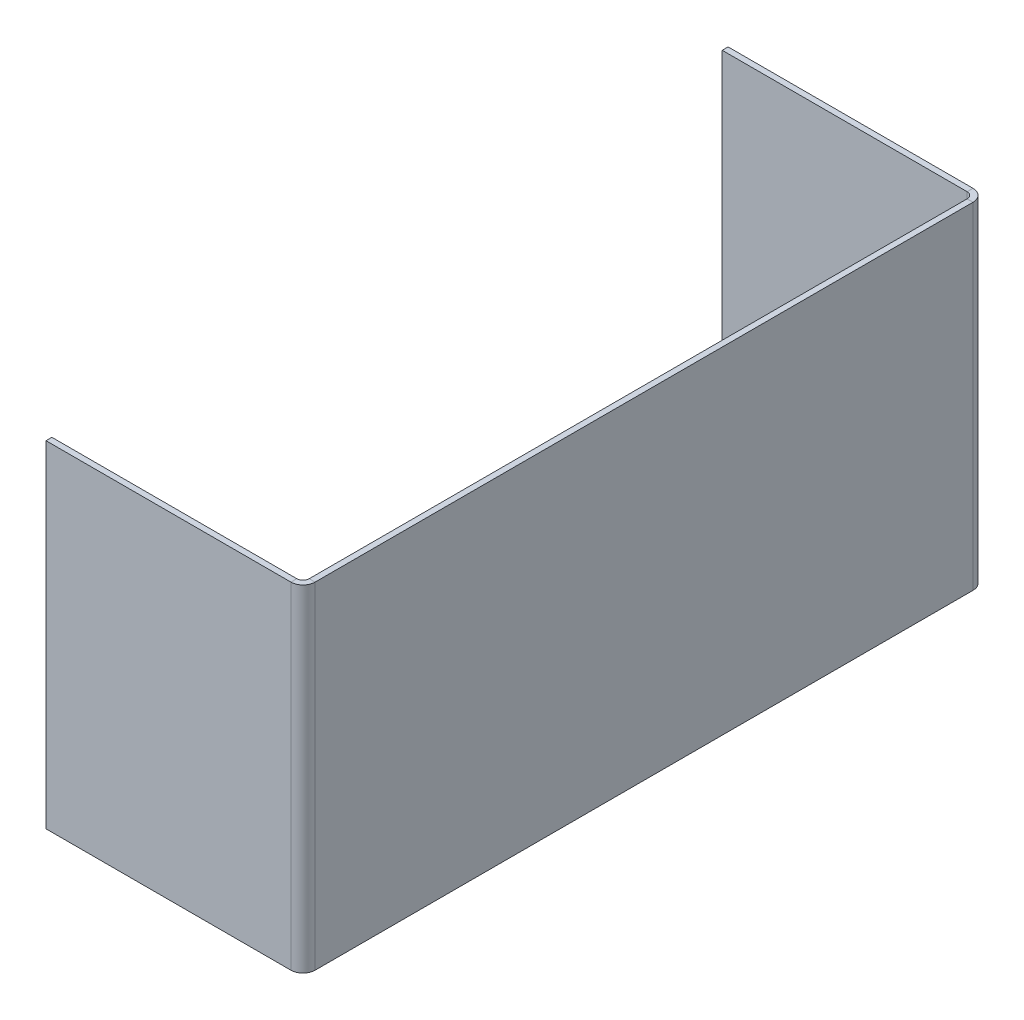
ISO-10303-21;
HEADER;
FILE_DESCRIPTION(('STEP AP214'),'2;1');
FILE_NAME('part.step','',(''),(''),'','','');
FILE_SCHEMA(('AUTOMOTIVE_DESIGN { 1 0 10303 214 1 1 1 1 }'));
ENDSEC;
DATA;
#1=APPLICATION_CONTEXT('core data for automotive mechanical design processes');
#2=APPLICATION_PROTOCOL_DEFINITION('international standard','automotive_design',2000,#1);
#3=PRODUCT_CONTEXT('',#1,'mechanical');
#4=PRODUCT('Part','Part','',(#3));
#5=PRODUCT_RELATED_PRODUCT_CATEGORY('part','',(#4));
#6=PRODUCT_DEFINITION_FORMATION('','',#4);
#7=PRODUCT_DEFINITION_CONTEXT('part definition',#1,'design');
#8=PRODUCT_DEFINITION('design','',#6,#7);
#9=PRODUCT_DEFINITION_SHAPE('','',#8);
#10=(LENGTH_UNIT() NAMED_UNIT(*) SI_UNIT(.MILLI.,.METRE.));
#11=(NAMED_UNIT(*) PLANE_ANGLE_UNIT() SI_UNIT($,.RADIAN.));
#12=(NAMED_UNIT(*) SI_UNIT($,.STERADIAN.) SOLID_ANGLE_UNIT());
#13=UNCERTAINTY_MEASURE_WITH_UNIT(LENGTH_MEASURE(1.E-05),#10,'distance_accuracy_value','');
#14=(GEOMETRIC_REPRESENTATION_CONTEXT(3) GLOBAL_UNCERTAINTY_ASSIGNED_CONTEXT((#13)) GLOBAL_UNIT_ASSIGNED_CONTEXT((#10,
#11,#12)) REPRESENTATION_CONTEXT('',''));
#15=CARTESIAN_POINT('',(0.,0.,0.));
#16=DIRECTION('',(0.,0.,1.));
#17=DIRECTION('',(1.,0.,0.));
#18=AXIS2_PLACEMENT_3D('',#15,#16,#17);
#19=CARTESIAN_POINT('',(29.3561924906218,40.,-30.1168136443477));
#20=DIRECTION('',(0.,1.,0.));
#21=DIRECTION('',(-1.,0.,0.));
#22=AXIS2_PLACEMENT_3D('',#19,#20,#21);
#23=PLANE('',#22);
#24=DIRECTION('',(0.,0.,-1.));
#25=VECTOR('',#24,1.);
#26=CARTESIAN_POINT('',(28.6561924906218,40.,-30.1168136443477));
#27=LINE('',#26,#25);
#28=CARTESIAN_POINT('',(28.6561924906214,40.,79.0297727113047));
#29=VERTEX_POINT('',#28);
#30=CARTESIAN_POINT('',(28.6561924906217,40.,0.736600000000004));
#31=VERTEX_POINT('',#30);
#32=EDGE_CURVE('E72',#29,#31,#27,.T.);
#33=ORIENTED_EDGE('',*,*,#32,.F.);
#34=DIRECTION('',(1.,0.,0.));
#35=VECTOR('',#34,1.);
#36=CARTESIAN_POINT('',(29.3561924906214,40.,79.0297727113047));
#37=LINE('',#36,#35);
#38=CARTESIAN_POINT('',(29.3561924906214,40.,79.0297727113047));
#39=VERTEX_POINT('',#38);
#40=EDGE_CURVE('E243',#29,#39,#37,.T.);
#41=ORIENTED_EDGE('',*,*,#40,.T.);
#42=DIRECTION('',(0.,0.,-1.));
#43=VECTOR('',#42,1.);
#44=CARTESIAN_POINT('',(29.3561924906218,40.,-30.1168136443477));
#45=LINE('',#44,#43);
#46=CARTESIAN_POINT('',(29.3561924906217,40.,0.73660000000001));
#47=VERTEX_POINT('',#46);
#48=EDGE_CURVE('E51',#39,#47,#45,.T.);
#49=ORIENTED_EDGE('',*,*,#48,.T.);
#50=DIRECTION('',(1.,0.,0.));
#51=VECTOR('',#50,1.);
#52=CARTESIAN_POINT('',(29.3561924906217,40.,0.736600000000007));
#53=LINE('',#52,#51);
#54=EDGE_CURVE('E238',#31,#47,#53,.T.);
#55=ORIENTED_EDGE('',*,*,#54,.F.);
#56=EDGE_LOOP('',(#33,#41,#49,#55));
#57=FACE_BOUND('',#56,.T.);
#58=ADVANCED_FACE('F47',(#57),#23,.T.);
#59=CARTESIAN_POINT('',(29.3561924906218,0.,-30.1168136443477));
#60=DIRECTION('',(0.,-1.,0.));
#61=DIRECTION('',(0.,0.,1.));
#62=AXIS2_PLACEMENT_3D('',#59,#60,#61);
#63=PLANE('',#62);
#64=DIRECTION('',(0.,0.,1.));
#65=VECTOR('',#64,1.);
#66=CARTESIAN_POINT('',(29.3561924906218,0.,-30.1168136443477));
#67=LINE('',#66,#65);
#68=CARTESIAN_POINT('',(29.3561924906217,0.,0.736600000000004));
#69=VERTEX_POINT('',#68);
#70=CARTESIAN_POINT('',(29.3561924906214,0.,79.0297727113047));
#71=VERTEX_POINT('',#70);
#72=EDGE_CURVE('E247',#69,#71,#67,.T.);
#73=ORIENTED_EDGE('',*,*,#72,.T.);
#74=DIRECTION('',(-1.,0.,0.));
#75=VECTOR('',#74,1.);
#76=CARTESIAN_POINT('',(29.3561924906214,0.,79.0297727113047));
#77=LINE('',#76,#75);
#78=CARTESIAN_POINT('',(28.6561924906214,0.,79.0297727113047));
#79=VERTEX_POINT('',#78);
#80=EDGE_CURVE('E12',#71,#79,#77,.T.);
#81=ORIENTED_EDGE('',*,*,#80,.T.);
#82=DIRECTION('',(0.,0.,1.));
#83=VECTOR('',#82,1.);
#84=CARTESIAN_POINT('',(28.6561924906218,0.,-30.1168136443477));
#85=LINE('',#84,#83);
#86=CARTESIAN_POINT('',(28.6561924906217,0.,0.7366));
#87=VERTEX_POINT('',#86);
#88=EDGE_CURVE('E201',#87,#79,#85,.T.);
#89=ORIENTED_EDGE('',*,*,#88,.F.);
#90=DIRECTION('',(-1.,0.,0.));
#91=VECTOR('',#90,1.);
#92=CARTESIAN_POINT('',(29.3561924906217,0.,0.736600000000007));
#93=LINE('',#92,#91);
#94=EDGE_CURVE('E232',#69,#87,#93,.T.);
#95=ORIENTED_EDGE('',*,*,#94,.F.);
#96=EDGE_LOOP('',(#73,#81,#89,#95));
#97=FACE_BOUND('',#96,.T.);
#98=ADVANCED_FACE('F49',(#97),#63,.T.);
#99=CARTESIAN_POINT('',(28.6561924906218,0.,-28.889819779317));
#100=DIRECTION('',(-1.,0.,0.));
#101=DIRECTION('',(0.,0.,1.));
#102=AXIS2_PLACEMENT_3D('',#99,#100,#101);
#103=PLANE('',#102);
#104=ORIENTED_EDGE('',*,*,#88,.T.);
#105=DIRECTION('',(0.,1.,0.));
#106=VECTOR('',#105,1.);
#107=CARTESIAN_POINT('',(28.6561924906214,0.,79.0297727113047));
#108=LINE('',#107,#106);
#109=EDGE_CURVE('E56',#79,#29,#108,.T.);
#110=ORIENTED_EDGE('',*,*,#109,.T.);
#111=ORIENTED_EDGE('',*,*,#32,.T.);
#112=DIRECTION('',(0.,1.,0.));
#113=VECTOR('',#112,1.);
#114=CARTESIAN_POINT('',(28.6561924906217,0.,0.736600000000004));
#115=LINE('',#114,#113);
#116=EDGE_CURVE('E235',#87,#31,#115,.T.);
#117=ORIENTED_EDGE('',*,*,#116,.F.);
#118=EDGE_LOOP('',(#104,#110,#111,#117));
#119=FACE_BOUND('',#118,.T.);
#120=ADVANCED_FACE('F251',(#119),#103,.T.);
#121=CARTESIAN_POINT('',(29.3561924906218,0.,-28.889819779317));
#122=DIRECTION('',(-1.,0.,0.));
#123=DIRECTION('',(0.,0.,1.));
#124=AXIS2_PLACEMENT_3D('',#121,#122,#123);
#125=PLANE('',#124);
#126=DIRECTION('',(0.,1.,0.));
#127=VECTOR('',#126,1.);
#128=CARTESIAN_POINT('',(29.3561924906214,0.,79.0297727113047));
#129=LINE('',#128,#127);
#130=EDGE_CURVE('E241',#71,#39,#129,.T.);
#131=ORIENTED_EDGE('',*,*,#130,.F.);
#132=ORIENTED_EDGE('',*,*,#72,.F.);
#133=DIRECTION('',(0.,1.,0.));
#134=VECTOR('',#133,1.);
#135=CARTESIAN_POINT('',(29.3561924906217,0.,0.736600000000007));
#136=LINE('',#135,#134);
#137=EDGE_CURVE('E230',#69,#47,#136,.T.);
#138=ORIENTED_EDGE('',*,*,#137,.T.);
#139=ORIENTED_EDGE('',*,*,#48,.F.);
#140=EDGE_LOOP('',(#131,#132,#138,#139));
#141=FACE_BOUND('',#140,.T.);
#142=ADVANCED_FACE('F262',(#141),#125,.F.);
#143=CARTESIAN_POINT('',(-1.22699386503066,40.,-0.7));
#144=DIRECTION('',(-1.,0.,0.));
#145=DIRECTION('',(0.,0.,1.));
#146=AXIS2_PLACEMENT_3D('',#143,#144,#145);
#147=PLANE('',#146);
#148=DIRECTION('',(0.,-1.,0.));
#149=VECTOR('',#148,1.);
#150=CARTESIAN_POINT('',(-1.22699386503066,40.,0.));
#151=LINE('',#150,#149);
#152=CARTESIAN_POINT('',(-1.22699386503066,40.,0.));
#153=VERTEX_POINT('',#152);
#154=CARTESIAN_POINT('',(-1.22699386503066,0.,0.));
#155=VERTEX_POINT('',#154);
#156=EDGE_CURVE('E207',#153,#155,#151,.T.);
#157=ORIENTED_EDGE('',*,*,#156,.F.);
#158=DIRECTION('',(0.,0.,1.));
#159=VECTOR('',#158,1.);
#160=CARTESIAN_POINT('',(-1.22699386503066,40.,-0.7));
#161=LINE('',#160,#159);
#162=CARTESIAN_POINT('',(-1.22699386503066,40.,-0.7));
#163=VERTEX_POINT('',#162);
#164=EDGE_CURVE('E198',#163,#153,#161,.T.);
#165=ORIENTED_EDGE('',*,*,#164,.F.);
#166=DIRECTION('',(0.,-1.,0.));
#167=VECTOR('',#166,1.);
#168=CARTESIAN_POINT('',(-1.22699386503066,40.,-0.7));
#169=LINE('',#168,#167);
#170=CARTESIAN_POINT('',(-1.22699386503066,0.,-0.7));
#171=VERTEX_POINT('',#170);
#172=EDGE_CURVE('E226',#163,#171,#169,.T.);
#173=ORIENTED_EDGE('',*,*,#172,.T.);
#174=DIRECTION('',(0.,0.,1.));
#175=VECTOR('',#174,1.);
#176=CARTESIAN_POINT('',(-1.22699386503066,0.,-0.7));
#177=LINE('',#176,#175);
#178=EDGE_CURVE('E224',#171,#155,#177,.T.);
#179=ORIENTED_EDGE('',*,*,#178,.T.);
#180=EDGE_LOOP('',(#157,#165,#173,#179));
#181=FACE_BOUND('',#180,.T.);
#182=ADVANCED_FACE('F302',(#181),#147,.T.);
#183=CARTESIAN_POINT('',(0.,0.,-0.7));
#184=DIRECTION('',(0.,0.,1.));
#185=DIRECTION('',(1.,0.,0.));
#186=AXIS2_PLACEMENT_3D('',#183,#184,#185);
#187=PLANE('',#186);
#188=DIRECTION('',(0.,1.,0.));
#189=VECTOR('',#188,1.);
#190=CARTESIAN_POINT('',(27.9195924906217,0.,-0.7));
#191=LINE('',#190,#189);
#192=CARTESIAN_POINT('',(27.9195924906217,0.,-0.7));
#193=VERTEX_POINT('',#192);
#194=CARTESIAN_POINT('',(27.9195924906217,40.,-0.7));
#195=VERTEX_POINT('',#194);
#196=EDGE_CURVE('E194',#193,#195,#191,.T.);
#197=ORIENTED_EDGE('',*,*,#196,.F.);
#198=DIRECTION('',(1.,0.,0.));
#199=VECTOR('',#198,1.);
#200=CARTESIAN_POINT('',(-1.22699386503066,0.,-0.7));
#201=LINE('',#200,#199);
#202=EDGE_CURVE('E221',#171,#193,#201,.T.);
#203=ORIENTED_EDGE('',*,*,#202,.F.);
#204=ORIENTED_EDGE('',*,*,#172,.F.);
#205=DIRECTION('',(-1.,0.,0.));
#206=VECTOR('',#205,1.);
#207=CARTESIAN_POINT('',(-1.22699386503066,40.,-0.7));
#208=LINE('',#207,#206);
#209=EDGE_CURVE('E202',#195,#163,#208,.T.);
#210=ORIENTED_EDGE('',*,*,#209,.F.);
#211=EDGE_LOOP('',(#197,#203,#204,#210));
#212=FACE_BOUND('',#211,.T.);
#213=ADVANCED_FACE('F306',(#212),#187,.F.);
#214=CARTESIAN_POINT('',(-1.22699386503066,0.,-0.7));
#215=DIRECTION('',(0.,-1.,0.));
#216=DIRECTION('',(1.,0.,0.));
#217=AXIS2_PLACEMENT_3D('',#214,#215,#216);
#218=PLANE('',#217);
#219=ORIENTED_EDGE('',*,*,#202,.T.);
#220=DIRECTION('',(0.,0.,1.));
#221=VECTOR('',#220,1.);
#222=CARTESIAN_POINT('',(27.9195924906217,0.,-0.7));
#223=LINE('',#222,#221);
#224=CARTESIAN_POINT('',(27.9195924906217,0.,0.));
#225=VERTEX_POINT('',#224);
#226=EDGE_CURVE('E218',#193,#225,#223,.T.);
#227=ORIENTED_EDGE('',*,*,#226,.T.);
#228=DIRECTION('',(1.,0.,0.));
#229=VECTOR('',#228,1.);
#230=CARTESIAN_POINT('',(-1.22699386503066,0.,0.));
#231=LINE('',#230,#229);
#232=EDGE_CURVE('E215',#155,#225,#231,.T.);
#233=ORIENTED_EDGE('',*,*,#232,.F.);
#234=ORIENTED_EDGE('',*,*,#178,.F.);
#235=EDGE_LOOP('',(#219,#227,#233,#234));
#236=FACE_BOUND('',#235,.T.);
#237=ADVANCED_FACE('F312',(#236),#218,.T.);
#238=CARTESIAN_POINT('',(0.,0.,0.));
#239=DIRECTION('',(0.,0.,1.));
#240=DIRECTION('',(1.,0.,0.));
#241=AXIS2_PLACEMENT_3D('',#238,#239,#240);
#242=PLANE('',#241);
#243=ORIENTED_EDGE('',*,*,#232,.T.);
#244=DIRECTION('',(0.,1.,0.));
#245=VECTOR('',#244,1.);
#246=CARTESIAN_POINT('',(27.9195924906217,0.,0.));
#247=LINE('',#246,#245);
#248=CARTESIAN_POINT('',(27.9195924906217,40.,0.));
#249=VERTEX_POINT('',#248);
#250=EDGE_CURVE('E212',#225,#249,#247,.T.);
#251=ORIENTED_EDGE('',*,*,#250,.T.);
#252=DIRECTION('',(-1.,0.,0.));
#253=VECTOR('',#252,1.);
#254=CARTESIAN_POINT('',(-1.22699386503066,40.,0.));
#255=LINE('',#254,#253);
#256=EDGE_CURVE('E210',#249,#153,#255,.T.);
#257=ORIENTED_EDGE('',*,*,#256,.T.);
#258=ORIENTED_EDGE('',*,*,#156,.T.);
#259=EDGE_LOOP('',(#243,#251,#257,#258));
#260=FACE_BOUND('',#259,.T.);
#261=ADVANCED_FACE('F322',(#260),#242,.T.);
#262=CARTESIAN_POINT('',(-1.22699386503066,40.,-0.7));
#263=DIRECTION('',(0.,1.,0.));
#264=DIRECTION('',(0.,0.,1.));
#265=AXIS2_PLACEMENT_3D('',#262,#263,#264);
#266=PLANE('',#265);
#267=ORIENTED_EDGE('',*,*,#256,.F.);
#268=DIRECTION('',(0.,0.,-1.));
#269=VECTOR('',#268,1.);
#270=CARTESIAN_POINT('',(27.9195924906217,40.,-0.7));
#271=LINE('',#270,#269);
#272=EDGE_CURVE('E204',#249,#195,#271,.T.);
#273=ORIENTED_EDGE('',*,*,#272,.T.);
#274=ORIENTED_EDGE('',*,*,#209,.T.);
#275=ORIENTED_EDGE('',*,*,#164,.T.);
#276=EDGE_LOOP('',(#267,#273,#274,#275));
#277=FACE_BOUND('',#276,.T.);
#278=ADVANCED_FACE('F325',(#277),#266,.T.);
#279=CARTESIAN_POINT('',(27.9195924906217,0.,0.7366));
#280=DIRECTION('',(0.,-1.,0.));
#281=DIRECTION('',(1.,0.,0.));
#282=AXIS2_PLACEMENT_3D('',#279,#280,#281);
#283=PLANE('',#282);
#284=ORIENTED_EDGE('',*,*,#94,.T.);
#285=CARTESIAN_POINT('',(27.9195924906217,0.,0.7366));
#286=DIRECTION('',(0.,-1.,0.));
#287=DIRECTION('',(1.,0.,0.));
#288=AXIS2_PLACEMENT_3D('',#285,#286,#287);
#289=CIRCLE('',#288,0.7366);
#290=EDGE_CURVE('E183',#87,#225,#289,.F.);
#291=ORIENTED_EDGE('',*,*,#290,.T.);
#292=ORIENTED_EDGE('',*,*,#226,.F.);
#293=CARTESIAN_POINT('',(27.9195924906217,0.,0.7366));
#294=DIRECTION('',(0.,1.,0.));
#295=DIRECTION('',(1.,0.,0.));
#296=AXIS2_PLACEMENT_3D('',#293,#294,#295);
#297=CIRCLE('',#296,1.4366);
#298=EDGE_CURVE('E187',#69,#193,#297,.T.);
#299=ORIENTED_EDGE('',*,*,#298,.F.);
#300=EDGE_LOOP('',(#284,#291,#292,#299));
#301=FACE_BOUND('',#300,.T.);
#302=ADVANCED_FACE('F317',(#301),#283,.T.);
#303=CARTESIAN_POINT('',(27.9195924906217,40.,0.7366));
#304=DIRECTION('',(0.,1.,0.));
#305=DIRECTION('',(0.,0.,1.));
#306=AXIS2_PLACEMENT_3D('',#303,#304,#305);
#307=PLANE('',#306);
#308=ORIENTED_EDGE('',*,*,#272,.F.);
#309=CARTESIAN_POINT('',(27.9195924906217,40.,0.7366));
#310=DIRECTION('',(0.,-1.,0.));
#311=DIRECTION('',(1.,0.,0.));
#312=AXIS2_PLACEMENT_3D('',#309,#310,#311);
#313=CIRCLE('',#312,0.7366);
#314=EDGE_CURVE('E191',#249,#31,#313,.T.);
#315=ORIENTED_EDGE('',*,*,#314,.T.);
#316=ORIENTED_EDGE('',*,*,#54,.T.);
#317=CARTESIAN_POINT('',(27.9195924906217,40.,0.7366));
#318=DIRECTION('',(0.,-1.,0.));
#319=DIRECTION('',(0.,0.,1.));
#320=AXIS2_PLACEMENT_3D('',#317,#318,#319);
#321=CIRCLE('',#320,1.4366);
#322=EDGE_CURVE('E190',#195,#47,#321,.T.);
#323=ORIENTED_EDGE('',*,*,#322,.F.);
#324=EDGE_LOOP('',(#308,#315,#316,#323));
#325=FACE_BOUND('',#324,.T.);
#326=ADVANCED_FACE('F332',(#325),#307,.T.);
#327=CARTESIAN_POINT('',(27.9195924906217,60.0425181450098,0.7366));
#328=DIRECTION('',(0.,-1.,0.));
#329=DIRECTION('',(1.,0.,0.));
#330=AXIS2_PLACEMENT_3D('',#327,#328,#329);
#331=CYLINDRICAL_SURFACE('',#330,1.4366);
#332=ORIENTED_EDGE('',*,*,#322,.T.);
#333=ORIENTED_EDGE('',*,*,#137,.F.);
#334=ORIENTED_EDGE('',*,*,#298,.T.);
#335=ORIENTED_EDGE('',*,*,#196,.T.);
#336=EDGE_LOOP('',(#332,#333,#334,#335));
#337=FACE_BOUND('',#336,.T.);
#338=ADVANCED_FACE('F350',(#337),#331,.T.);
#339=CARTESIAN_POINT('',(27.9195924906217,60.0425181450098,0.7366));
#340=DIRECTION('',(0.,-1.,0.));
#341=DIRECTION('',(1.,0.,0.));
#342=AXIS2_PLACEMENT_3D('',#339,#340,#341);
#343=CYLINDRICAL_SURFACE('',#342,0.7366);
#344=ORIENTED_EDGE('',*,*,#314,.F.);
#345=ORIENTED_EDGE('',*,*,#250,.F.);
#346=ORIENTED_EDGE('',*,*,#290,.F.);
#347=ORIENTED_EDGE('',*,*,#116,.T.);
#348=EDGE_LOOP('',(#344,#345,#346,#347));
#349=FACE_BOUND('',#348,.T.);
#350=ADVANCED_FACE('F341',(#349),#343,.F.);
#351=CARTESIAN_POINT('',(27.9195924906214,0.,79.0297727113047));
#352=DIRECTION('',(0.,-1.,0.));
#353=DIRECTION('',(1.,0.,0.));
#354=AXIS2_PLACEMENT_3D('',#351,#352,#353);
#355=PLANE('',#354);
#356=DIRECTION('',(0.,0.,-1.));
#357=VECTOR('',#356,1.);
#358=CARTESIAN_POINT('',(27.9195924906214,0.,80.4663727113047));
#359=LINE('',#358,#357);
#360=CARTESIAN_POINT('',(27.9195924906214,0.,80.4663727113047));
#361=VERTEX_POINT('',#360);
#362=CARTESIAN_POINT('',(27.9195924906214,0.,79.7663727113047));
#363=VERTEX_POINT('',#362);
#364=EDGE_CURVE('E146',#361,#363,#359,.T.);
#365=ORIENTED_EDGE('',*,*,#364,.T.);
#366=CARTESIAN_POINT('',(27.9195924906214,0.,79.0297727113047));
#367=DIRECTION('',(0.,-1.,0.));
#368=DIRECTION('',(1.,0.,0.));
#369=AXIS2_PLACEMENT_3D('',#366,#367,#368);
#370=CIRCLE('',#369,0.7366);
#371=EDGE_CURVE('E64',#363,#79,#370,.F.);
#372=ORIENTED_EDGE('',*,*,#371,.T.);
#373=ORIENTED_EDGE('',*,*,#80,.F.);
#374=CARTESIAN_POINT('',(27.9195924906214,0.,79.0297727113047));
#375=DIRECTION('',(0.,1.,0.));
#376=DIRECTION('',(1.,0.,0.));
#377=AXIS2_PLACEMENT_3D('',#374,#375,#376);
#378=CIRCLE('',#377,1.4366);
#379=EDGE_CURVE('E176',#361,#71,#378,.T.);
#380=ORIENTED_EDGE('',*,*,#379,.F.);
#381=EDGE_LOOP('',(#365,#372,#373,#380));
#382=FACE_BOUND('',#381,.T.);
#383=ADVANCED_FACE('F254',(#382),#355,.T.);
#384=CARTESIAN_POINT('',(27.9195924906214,40.,79.0297727113047));
#385=DIRECTION('',(0.,1.,0.));
#386=DIRECTION('',(0.,0.,1.));
#387=AXIS2_PLACEMENT_3D('',#384,#385,#386);
#388=PLANE('',#387);
#389=ORIENTED_EDGE('',*,*,#40,.F.);
#390=CARTESIAN_POINT('',(27.9195924906214,40.,79.0297727113047));
#391=DIRECTION('',(0.,-1.,0.));
#392=DIRECTION('',(1.,0.,0.));
#393=AXIS2_PLACEMENT_3D('',#390,#391,#392);
#394=CIRCLE('',#393,0.7366);
#395=CARTESIAN_POINT('',(27.9195924906214,40.,79.7663727113047));
#396=VERTEX_POINT('',#395);
#397=EDGE_CURVE('E180',#29,#396,#394,.T.);
#398=ORIENTED_EDGE('',*,*,#397,.T.);
#399=DIRECTION('',(0.,0.,1.));
#400=VECTOR('',#399,1.);
#401=CARTESIAN_POINT('',(27.9195924906214,40.,80.4663727113047));
#402=LINE('',#401,#400);
#403=CARTESIAN_POINT('',(27.9195924906214,40.,80.4663727113047));
#404=VERTEX_POINT('',#403);
#405=EDGE_CURVE('E164',#396,#404,#402,.T.);
#406=ORIENTED_EDGE('',*,*,#405,.T.);
#407=CARTESIAN_POINT('',(27.9195924906214,40.,79.0297727113047));
#408=DIRECTION('',(0.,-1.,0.));
#409=DIRECTION('',(0.,0.,1.));
#410=AXIS2_PLACEMENT_3D('',#407,#408,#409);
#411=CIRCLE('',#410,1.4366);
#412=EDGE_CURVE('E179',#39,#404,#411,.T.);
#413=ORIENTED_EDGE('',*,*,#412,.F.);
#414=EDGE_LOOP('',(#389,#398,#406,#413));
#415=FACE_BOUND('',#414,.T.);
#416=ADVANCED_FACE('F268',(#415),#388,.T.);
#417=CARTESIAN_POINT('',(27.9195924906214,60.0425181450097,79.0297727113047));
#418=DIRECTION('',(0.,-1.,0.));
#419=DIRECTION('',(1.,0.,0.));
#420=AXIS2_PLACEMENT_3D('',#417,#418,#419);
#421=CYLINDRICAL_SURFACE('',#420,1.4366);
#422=ORIENTED_EDGE('',*,*,#412,.T.);
#423=DIRECTION('',(0.,1.,0.));
#424=VECTOR('',#423,1.);
#425=CARTESIAN_POINT('',(27.9195924906214,0.,80.4663727113047));
#426=LINE('',#425,#424);
#427=EDGE_CURVE('E166',#361,#404,#426,.T.);
#428=ORIENTED_EDGE('',*,*,#427,.F.);
#429=ORIENTED_EDGE('',*,*,#379,.T.);
#430=ORIENTED_EDGE('',*,*,#130,.T.);
#431=EDGE_LOOP('',(#422,#428,#429,#430));
#432=FACE_BOUND('',#431,.T.);
#433=ADVANCED_FACE('F258',(#432),#421,.T.);
#434=CARTESIAN_POINT('',(27.9195924906214,60.0425181450097,79.0297727113047));
#435=DIRECTION('',(0.,-1.,0.));
#436=DIRECTION('',(1.,0.,0.));
#437=AXIS2_PLACEMENT_3D('',#434,#435,#436);
#438=CYLINDRICAL_SURFACE('',#437,0.7366);
#439=ORIENTED_EDGE('',*,*,#397,.F.);
#440=ORIENTED_EDGE('',*,*,#109,.F.);
#441=ORIENTED_EDGE('',*,*,#371,.F.);
#442=DIRECTION('',(0.,1.,0.));
#443=VECTOR('',#442,1.);
#444=CARTESIAN_POINT('',(27.9195924906214,0.,79.7663727113047));
#445=LINE('',#444,#443);
#446=EDGE_CURVE('E169',#363,#396,#445,.T.);
#447=ORIENTED_EDGE('',*,*,#446,.T.);
#448=EDGE_LOOP('',(#439,#440,#441,#447));
#449=FACE_BOUND('',#448,.T.);
#450=ADVANCED_FACE('F270',(#449),#438,.F.);
#451=CARTESIAN_POINT('',(-1.22699386503093,40.,80.4663727113045));
#452=DIRECTION('',(-1.,0.,0.));
#453=DIRECTION('',(0.,0.,1.));
#454=AXIS2_PLACEMENT_3D('',#451,#452,#453);
#455=PLANE('',#454);
#456=DIRECTION('',(0.,1.,0.));
#457=VECTOR('',#456,1.);
#458=CARTESIAN_POINT('',(-1.22699386503093,40.,79.7663727113045));
#459=LINE('',#458,#457);
#460=CARTESIAN_POINT('',(-1.22699386503093,0.,79.7663727113045));
#461=VERTEX_POINT('',#460);
#462=CARTESIAN_POINT('',(-1.22699386503093,40.,79.7663727113045));
#463=VERTEX_POINT('',#462);
#464=EDGE_CURVE('E159',#461,#463,#459,.T.);
#465=ORIENTED_EDGE('',*,*,#464,.F.);
#466=DIRECTION('',(0.,0.,-1.));
#467=VECTOR('',#466,1.);
#468=CARTESIAN_POINT('',(-1.22699386503093,0.,80.4663727113045));
#469=LINE('',#468,#467);
#470=CARTESIAN_POINT('',(-1.22699386503093,0.,80.4663727113045));
#471=VERTEX_POINT('',#470);
#472=EDGE_CURVE('E144',#471,#461,#469,.T.);
#473=ORIENTED_EDGE('',*,*,#472,.F.);
#474=DIRECTION('',(0.,1.,0.));
#475=VECTOR('',#474,1.);
#476=CARTESIAN_POINT('',(-1.22699386503093,40.,80.4663727113045));
#477=LINE('',#476,#475);
#478=CARTESIAN_POINT('',(-1.22699386503093,40.,80.4663727113045));
#479=VERTEX_POINT('',#478);
#480=EDGE_CURVE('E156',#471,#479,#477,.T.);
#481=ORIENTED_EDGE('',*,*,#480,.T.);
#482=DIRECTION('',(0.,0.,-1.));
#483=VECTOR('',#482,1.);
#484=CARTESIAN_POINT('',(-1.22699386503093,40.,80.4663727113045));
#485=LINE('',#484,#483);
#486=EDGE_CURVE('E163',#479,#463,#485,.T.);
#487=ORIENTED_EDGE('',*,*,#486,.T.);
#488=EDGE_LOOP('',(#465,#473,#481,#487));
#489=FACE_BOUND('',#488,.T.);
#490=ADVANCED_FACE('F155',(#489),#455,.T.);
#491=CARTESIAN_POINT('',(137.546012269938,0.,80.4663727113054));
#492=DIRECTION('',(0.,0.,-1.));
#493=DIRECTION('',(-1.,0.,0.));
#494=AXIS2_PLACEMENT_3D('',#491,#492,#493);
#495=PLANE('',#494);
#496=DIRECTION('',(-1.,0.,0.));
#497=VECTOR('',#496,1.);
#498=CARTESIAN_POINT('',(138.773006134969,0.,80.4663727113054));
#499=LINE('',#498,#497);
#500=EDGE_CURVE('E141',#361,#471,#499,.T.);
#501=ORIENTED_EDGE('',*,*,#500,.F.);
#502=ORIENTED_EDGE('',*,*,#427,.T.);
#503=DIRECTION('',(1.,0.,0.));
#504=VECTOR('',#503,1.);
#505=CARTESIAN_POINT('',(138.773006134969,40.,80.4663727113054));
#506=LINE('',#505,#504);
#507=EDGE_CURVE('E162',#479,#404,#506,.T.);
#508=ORIENTED_EDGE('',*,*,#507,.F.);
#509=ORIENTED_EDGE('',*,*,#480,.F.);
#510=EDGE_LOOP('',(#501,#502,#508,#509));
#511=FACE_BOUND('',#510,.T.);
#512=ADVANCED_FACE('F161',(#511),#495,.F.);
#513=CARTESIAN_POINT('',(138.773006134969,40.,80.4663727113054));
#514=DIRECTION('',(0.,1.,0.));
#515=DIRECTION('',(0.,0.,-1.));
#516=AXIS2_PLACEMENT_3D('',#513,#514,#515);
#517=PLANE('',#516);
#518=ORIENTED_EDGE('',*,*,#405,.F.);
#519=DIRECTION('',(1.,0.,0.));
#520=VECTOR('',#519,1.);
#521=CARTESIAN_POINT('',(138.773006134969,40.,79.7663727113054));
#522=LINE('',#521,#520);
#523=EDGE_CURVE('E151',#463,#396,#522,.T.);
#524=ORIENTED_EDGE('',*,*,#523,.F.);
#525=ORIENTED_EDGE('',*,*,#486,.F.);
#526=ORIENTED_EDGE('',*,*,#507,.T.);
#527=EDGE_LOOP('',(#518,#524,#525,#526));
#528=FACE_BOUND('',#527,.T.);
#529=ADVANCED_FACE('F279',(#528),#517,.T.);
#530=CARTESIAN_POINT('',(137.546012269938,0.,79.7663727113054));
#531=DIRECTION('',(0.,0.,-1.));
#532=DIRECTION('',(-1.,0.,0.));
#533=AXIS2_PLACEMENT_3D('',#530,#531,#532);
#534=PLANE('',#533);
#535=ORIENTED_EDGE('',*,*,#446,.F.);
#536=DIRECTION('',(-1.,0.,0.));
#537=VECTOR('',#536,1.);
#538=CARTESIAN_POINT('',(138.773006134969,0.,79.7663727113054));
#539=LINE('',#538,#537);
#540=EDGE_CURVE('E274',#363,#461,#539,.T.);
#541=ORIENTED_EDGE('',*,*,#540,.T.);
#542=ORIENTED_EDGE('',*,*,#464,.T.);
#543=ORIENTED_EDGE('',*,*,#523,.T.);
#544=EDGE_LOOP('',(#535,#541,#542,#543));
#545=FACE_BOUND('',#544,.T.);
#546=ADVANCED_FACE('F273',(#545),#534,.T.);
#547=CARTESIAN_POINT('',(138.773006134969,0.,80.4663727113054));
#548=DIRECTION('',(0.,-1.,0.));
#549=DIRECTION('',(-1.,0.,0.));
#550=AXIS2_PLACEMENT_3D('',#547,#548,#549);
#551=PLANE('',#550);
#552=ORIENTED_EDGE('',*,*,#364,.F.);
#553=ORIENTED_EDGE('',*,*,#500,.T.);
#554=ORIENTED_EDGE('',*,*,#472,.T.);
#555=ORIENTED_EDGE('',*,*,#540,.F.);
#556=EDGE_LOOP('',(#552,#553,#554,#555));
#557=FACE_BOUND('',#556,.T.);
#558=ADVANCED_FACE('F143',(#557),#551,.T.);
#559=CLOSED_SHELL('',(#58,#98,#120,#142,#182,#213,#237,#261,#278,#302,#326,#338,#350,#383,#416,
#433,#450,#490,#512,#529,#546,#558));
#560=MANIFOLD_SOLID_BREP('B2',#559);
#561=ADVANCED_BREP_SHAPE_REPRESENTATION('',(#18,#560),#14);
#562=SHAPE_DEFINITION_REPRESENTATION(#9,#561);
ENDSEC;
END-ISO-10303-21;
